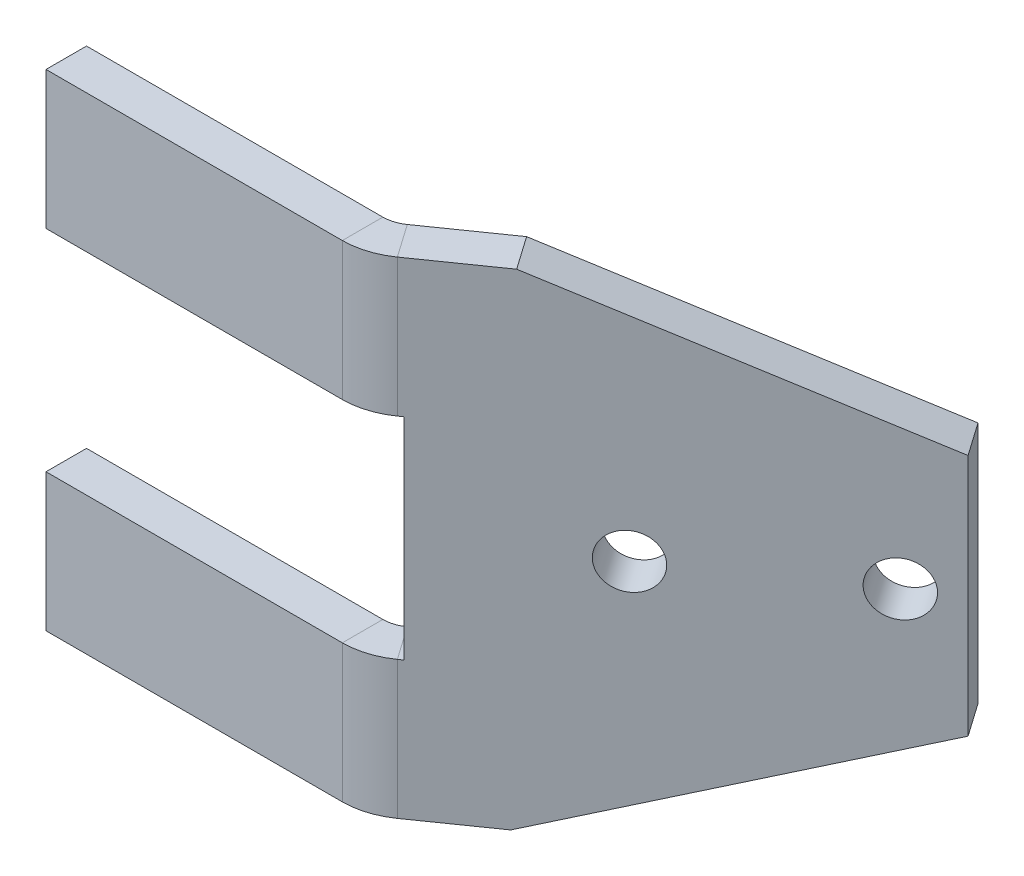
ISO-10303-21;
HEADER;
FILE_DESCRIPTION(('STEP AP214'),'2;1');
FILE_NAME('part.step','',(''),(''),'','','');
FILE_SCHEMA(('AUTOMOTIVE_DESIGN { 1 0 10303 214 1 1 1 1 }'));
ENDSEC;
DATA;
#1=APPLICATION_CONTEXT('core data for automotive mechanical design processes');
#2=APPLICATION_PROTOCOL_DEFINITION('international standard','automotive_design',2000,#1);
#3=PRODUCT_CONTEXT('',#1,'mechanical');
#4=PRODUCT('Part','Part','',(#3));
#5=PRODUCT_RELATED_PRODUCT_CATEGORY('part','',(#4));
#6=PRODUCT_DEFINITION_FORMATION('','',#4);
#7=PRODUCT_DEFINITION_CONTEXT('part definition',#1,'design');
#8=PRODUCT_DEFINITION('design','',#6,#7);
#9=PRODUCT_DEFINITION_SHAPE('','',#8);
#10=(LENGTH_UNIT() NAMED_UNIT(*) SI_UNIT(.MILLI.,.METRE.));
#11=(NAMED_UNIT(*) PLANE_ANGLE_UNIT() SI_UNIT($,.RADIAN.));
#12=(NAMED_UNIT(*) SI_UNIT($,.STERADIAN.) SOLID_ANGLE_UNIT());
#13=UNCERTAINTY_MEASURE_WITH_UNIT(LENGTH_MEASURE(1.E-05),#10,'distance_accuracy_value','');
#14=(GEOMETRIC_REPRESENTATION_CONTEXT(3) GLOBAL_UNCERTAINTY_ASSIGNED_CONTEXT((#13)) GLOBAL_UNIT_ASSIGNED_CONTEXT((#10,
#11,#12)) REPRESENTATION_CONTEXT('',''));
#15=CARTESIAN_POINT('',(0.,0.,0.));
#16=DIRECTION('',(0.,0.,1.));
#17=DIRECTION('',(1.,0.,0.));
#18=AXIS2_PLACEMENT_3D('',#15,#16,#17);
#19=CARTESIAN_POINT('',(54.7746723395931,44.4613849765258,-2.5));
#20=DIRECTION('',(0.,-1.,0.));
#21=DIRECTION('',(0.,0.,-1.));
#22=AXIS2_PLACEMENT_3D('',#19,#20,#21);
#23=PLANE('',#22);
#24=DIRECTION('',(1.,0.,0.));
#25=VECTOR('',#24,1.);
#26=CARTESIAN_POINT('',(54.7746723395931,44.4613849765258,-2.5));
#27=LINE('',#26,#25);
#28=CARTESIAN_POINT('',(54.7746723395931,44.4613849765258,-2.5));
#29=VERTEX_POINT('',#28);
#30=CARTESIAN_POINT('',(73.0608277896377,44.4613849765258,-2.5));
#31=VERTEX_POINT('',#30);
#32=EDGE_CURVE('E312',#29,#31,#27,.T.);
#33=ORIENTED_EDGE('',*,*,#32,.T.);
#34=DIRECTION('',(0.,0.,1.));
#35=VECTOR('',#34,1.);
#36=CARTESIAN_POINT('',(73.0608277896377,44.4613849765258,-2.5));
#37=LINE('',#36,#35);
#38=CARTESIAN_POINT('',(73.0608277896377,44.4613849765258,0.));
#39=VERTEX_POINT('',#38);
#40=EDGE_CURVE('E12',#31,#39,#37,.T.);
#41=ORIENTED_EDGE('',*,*,#40,.T.);
#42=DIRECTION('',(1.,0.,0.));
#43=VECTOR('',#42,1.);
#44=CARTESIAN_POINT('',(54.7746723395931,44.4613849765258,0.));
#45=LINE('',#44,#43);
#46=CARTESIAN_POINT('',(54.7746723395931,44.4613849765258,0.));
#47=VERTEX_POINT('',#46);
#48=EDGE_CURVE('E56',#47,#39,#45,.T.);
#49=ORIENTED_EDGE('',*,*,#48,.F.);
#50=DIRECTION('',(0.,0.,1.));
#51=VECTOR('',#50,1.);
#52=CARTESIAN_POINT('',(54.7746723395931,44.4613849765258,-2.5));
#53=LINE('',#52,#51);
#54=EDGE_CURVE('E315',#29,#47,#53,.T.);
#55=ORIENTED_EDGE('',*,*,#54,.F.);
#56=EDGE_LOOP('',(#33,#41,#49,#55));
#57=FACE_BOUND('',#56,.T.);
#58=ADVANCED_FACE('F40',(#57),#23,.T.);
#59=CARTESIAN_POINT('',(54.7746723395931,52.9613849765258,-2.5));
#60=DIRECTION('',(0.,1.,0.));
#61=DIRECTION('',(0.,0.,1.));
#62=AXIS2_PLACEMENT_3D('',#59,#60,#61);
#63=PLANE('',#62);
#64=DIRECTION('',(-1.,0.,0.));
#65=VECTOR('',#64,1.);
#66=CARTESIAN_POINT('',(54.7746723395931,52.9613849765258,0.));
#67=LINE('',#66,#65);
#68=CARTESIAN_POINT('',(73.0608277896377,52.9613849765258,0.));
#69=VERTEX_POINT('',#68);
#70=CARTESIAN_POINT('',(54.7746723395931,52.9613849765258,0.));
#71=VERTEX_POINT('',#70);
#72=EDGE_CURVE('E63',#69,#71,#67,.T.);
#73=ORIENTED_EDGE('',*,*,#72,.F.);
#74=DIRECTION('',(0.,0.,-1.));
#75=VECTOR('',#74,1.);
#76=CARTESIAN_POINT('',(73.0608277896377,52.9613849765258,-2.5));
#77=LINE('',#76,#75);
#78=CARTESIAN_POINT('',(73.0608277896377,52.9613849765258,-2.5));
#79=VERTEX_POINT('',#78);
#80=EDGE_CURVE('E322',#69,#79,#77,.T.);
#81=ORIENTED_EDGE('',*,*,#80,.T.);
#82=DIRECTION('',(-1.,0.,0.));
#83=VECTOR('',#82,1.);
#84=CARTESIAN_POINT('',(54.7746723395931,52.9613849765258,-2.5));
#85=LINE('',#84,#83);
#86=CARTESIAN_POINT('',(54.7746723395931,52.9613849765258,-2.5));
#87=VERTEX_POINT('',#86);
#88=EDGE_CURVE('E43',#79,#87,#85,.T.);
#89=ORIENTED_EDGE('',*,*,#88,.T.);
#90=DIRECTION('',(0.,0.,1.));
#91=VECTOR('',#90,1.);
#92=CARTESIAN_POINT('',(54.7746723395931,52.9613849765258,-2.5));
#93=LINE('',#92,#91);
#94=EDGE_CURVE('E318',#87,#71,#93,.T.);
#95=ORIENTED_EDGE('',*,*,#94,.T.);
#96=EDGE_LOOP('',(#73,#81,#89,#95));
#97=FACE_BOUND('',#96,.T.);
#98=ADVANCED_FACE('F332',(#97),#63,.T.);
#99=CARTESIAN_POINT('',(54.7746723395931,31.4613849765258,0.));
#100=DIRECTION('',(0.,0.,1.));
#101=DIRECTION('',(1.,0.,0.));
#102=AXIS2_PLACEMENT_3D('',#99,#100,#101);
#103=PLANE('',#102);
#104=ORIENTED_EDGE('',*,*,#48,.T.);
#105=DIRECTION('',(0.,1.,0.));
#106=VECTOR('',#105,1.);
#107=CARTESIAN_POINT('',(73.0608277896377,31.4613849765258,0.));
#108=LINE('',#107,#106);
#109=EDGE_CURVE('E48',#39,#69,#108,.T.);
#110=ORIENTED_EDGE('',*,*,#109,.T.);
#111=ORIENTED_EDGE('',*,*,#72,.T.);
#112=DIRECTION('',(0.,-1.,0.));
#113=VECTOR('',#112,1.);
#114=CARTESIAN_POINT('',(54.7746723395931,44.4613849765258,0.));
#115=LINE('',#114,#113);
#116=EDGE_CURVE('E313',#71,#47,#115,.T.);
#117=ORIENTED_EDGE('',*,*,#116,.T.);
#118=EDGE_LOOP('',(#104,#110,#111,#117));
#119=FACE_BOUND('',#118,.T.);
#120=ADVANCED_FACE('F327',(#119),#103,.T.);
#121=CARTESIAN_POINT('',(54.7746723395931,44.4613849765258,-2.5));
#122=DIRECTION('',(-1.,0.,0.));
#123=DIRECTION('',(0.,0.,1.));
#124=AXIS2_PLACEMENT_3D('',#121,#122,#123);
#125=PLANE('',#124);
#126=ORIENTED_EDGE('',*,*,#116,.F.);
#127=ORIENTED_EDGE('',*,*,#94,.F.);
#128=DIRECTION('',(0.,-1.,0.));
#129=VECTOR('',#128,1.);
#130=CARTESIAN_POINT('',(54.7746723395931,44.4613849765258,-2.5));
#131=LINE('',#130,#129);
#132=EDGE_CURVE('E309',#87,#29,#131,.T.);
#133=ORIENTED_EDGE('',*,*,#132,.T.);
#134=ORIENTED_EDGE('',*,*,#54,.T.);
#135=EDGE_LOOP('',(#126,#127,#133,#134));
#136=FACE_BOUND('',#135,.T.);
#137=ADVANCED_FACE('F336',(#136),#125,.T.);
#138=CARTESIAN_POINT('',(54.7746723395931,31.4613849765258,-2.5));
#139=DIRECTION('',(0.,0.,1.));
#140=DIRECTION('',(1.,0.,0.));
#141=AXIS2_PLACEMENT_3D('',#138,#139,#140);
#142=PLANE('',#141);
#143=DIRECTION('',(0.,1.,0.));
#144=VECTOR('',#143,1.);
#145=CARTESIAN_POINT('',(73.0608277896377,31.4613849765258,-2.5));
#146=LINE('',#145,#144);
#147=EDGE_CURVE('E317',#31,#79,#146,.T.);
#148=ORIENTED_EDGE('',*,*,#147,.F.);
#149=ORIENTED_EDGE('',*,*,#32,.F.);
#150=ORIENTED_EDGE('',*,*,#132,.F.);
#151=ORIENTED_EDGE('',*,*,#88,.F.);
#152=EDGE_LOOP('',(#148,#149,#150,#151));
#153=FACE_BOUND('',#152,.T.);
#154=ADVANCED_FACE('F368',(#153),#142,.F.);
#155=CARTESIAN_POINT('',(94.921186591453,30.4613849765258,-17.3652388434772));
#156=DIRECTION('',(0.284341886021681,-0.937821702691951,-0.199098332021148));
#157=DIRECTION('',(0.768218564938694,0.347117348975775,-0.537912430162721));
#158=AXIS2_PLACEMENT_3D('',#155,#156,#157);
#159=PLANE('',#158);
#160=DIRECTION('',(0.768218564938694,0.347117348975775,-0.537912430162721));
#161=VECTOR('',#160,1.);
#162=CARTESIAN_POINT('',(96.3551276823306,30.4613849765258,-15.3173587327547));
#163=LINE('',#162,#161);
#164=CARTESIAN_POINT('',(79.7565933421692,22.9613849765258,-3.69493986454089));
#165=VERTEX_POINT('',#164);
#166=CARTESIAN_POINT('',(96.3551276823306,30.4613849765258,-15.3173587327547));
#167=VERTEX_POINT('',#166);
#168=EDGE_CURVE('E247',#165,#167,#163,.T.);
#169=ORIENTED_EDGE('',*,*,#168,.F.);
#170=DIRECTION('',(0.573576436351047,0.,0.819152044288991));
#171=VECTOR('',#170,1.);
#172=CARTESIAN_POINT('',(78.3226522512915,22.9613849765258,-5.74281997526337));
#173=LINE('',#172,#171);
#174=CARTESIAN_POINT('',(78.3226522512915,22.9613849765258,-5.74281997526337));
#175=VERTEX_POINT('',#174);
#176=EDGE_CURVE('E220',#175,#165,#173,.T.);
#177=ORIENTED_EDGE('',*,*,#176,.F.);
#178=DIRECTION('',(0.768218564938694,0.347117348975775,-0.537912430162721));
#179=VECTOR('',#178,1.);
#180=CARTESIAN_POINT('',(94.921186591453,30.4613849765258,-17.3652388434772));
#181=LINE('',#180,#179);
#182=CARTESIAN_POINT('',(94.921186591453,30.4613849765258,-17.3652388434772));
#183=VERTEX_POINT('',#182);
#184=EDGE_CURVE('E289',#175,#183,#181,.T.);
#185=ORIENTED_EDGE('',*,*,#184,.T.);
#186=DIRECTION('',(0.573576436351047,0.,0.819152044288991));
#187=VECTOR('',#186,1.);
#188=CARTESIAN_POINT('',(94.921186591453,30.4613849765258,-17.3652388434772));
#189=LINE('',#188,#187);
#190=EDGE_CURVE('E287',#183,#167,#189,.T.);
#191=ORIENTED_EDGE('',*,*,#190,.T.);
#192=EDGE_LOOP('',(#169,#177,#185,#191));
#193=FACE_BOUND('',#192,.T.);
#194=ADVANCED_FACE('F402',(#193),#159,.T.);
#195=CARTESIAN_POINT('',(94.921186591453,30.4613849765258,-17.3652388434772));
#196=DIRECTION('',(0.819152044288991,0.,-0.573576436351047));
#197=DIRECTION('',(-0.573576436351047,0.,-0.819152044288991));
#198=AXIS2_PLACEMENT_3D('',#195,#196,#197);
#199=PLANE('',#198);
#200=DIRECTION('',(0.,1.,0.));
#201=VECTOR('',#200,1.);
#202=CARTESIAN_POINT('',(96.3551276823306,30.4613849765258,-15.3173587327547));
#203=LINE('',#202,#201);
#204=CARTESIAN_POINT('',(96.3551276823306,45.4613849765258,-15.3173587327547));
#205=VERTEX_POINT('',#204);
#206=EDGE_CURVE('E244',#167,#205,#203,.T.);
#207=ORIENTED_EDGE('',*,*,#206,.F.);
#208=ORIENTED_EDGE('',*,*,#190,.F.);
#209=DIRECTION('',(0.,1.,0.));
#210=VECTOR('',#209,1.);
#211=CARTESIAN_POINT('',(94.921186591453,30.4613849765258,-17.3652388434772));
#212=LINE('',#211,#210);
#213=CARTESIAN_POINT('',(94.921186591453,45.4613849765258,-17.3652388434772));
#214=VERTEX_POINT('',#213);
#215=EDGE_CURVE('E284',#183,#214,#212,.T.);
#216=ORIENTED_EDGE('',*,*,#215,.T.);
#217=DIRECTION('',(0.573576436351047,0.,0.819152044288991));
#218=VECTOR('',#217,1.);
#219=CARTESIAN_POINT('',(94.921186591453,45.4613849765258,-17.3652388434772));
#220=LINE('',#219,#218);
#221=EDGE_CURVE('E282',#214,#205,#220,.T.);
#222=ORIENTED_EDGE('',*,*,#221,.T.);
#223=EDGE_LOOP('',(#207,#208,#216,#222));
#224=FACE_BOUND('',#223,.T.);
#225=ADVANCED_FACE('F405',(#224),#199,.T.);
#226=CARTESIAN_POINT('',(78.5381457056732,52.9613849765258,-5.89371011645624));
#227=DIRECTION('',(0.287623484974917,0.936329177569045,-0.201396132345585));
#228=DIRECTION('',(-0.766995959933113,0.351123441588392,0.53705635292156));
#229=AXIS2_PLACEMENT_3D('',#226,#227,#228);
#230=PLANE('',#229);
#231=DIRECTION('',(-0.766995959933113,0.351123441588392,0.53705635292156));
#232=VECTOR('',#231,1.);
#233=CARTESIAN_POINT('',(79.9720867965508,52.9613849765258,-3.84583000573377));
#234=LINE('',#233,#232);
#235=CARTESIAN_POINT('',(79.9720867965508,52.9613849765258,-3.84583000573377));
#236=VERTEX_POINT('',#235);
#237=EDGE_CURVE('E241',#205,#236,#234,.T.);
#238=ORIENTED_EDGE('',*,*,#237,.F.);
#239=ORIENTED_EDGE('',*,*,#221,.F.);
#240=DIRECTION('',(-0.766995959933113,0.351123441588392,0.53705635292156));
#241=VECTOR('',#240,1.);
#242=CARTESIAN_POINT('',(78.5381457056732,52.9613849765258,-5.89371011645624));
#243=LINE('',#242,#241);
#244=CARTESIAN_POINT('',(78.5381457056732,52.9613849765258,-5.89371011645624));
#245=VERTEX_POINT('',#244);
#246=EDGE_CURVE('E279',#214,#245,#243,.T.);
#247=ORIENTED_EDGE('',*,*,#246,.T.);
#248=DIRECTION('',(0.573576436351047,0.,0.819152044288991));
#249=VECTOR('',#248,1.);
#250=CARTESIAN_POINT('',(78.5381457056732,52.9613849765258,-5.89371011645624));
#251=LINE('',#250,#249);
#252=EDGE_CURVE('E277',#245,#236,#251,.T.);
#253=ORIENTED_EDGE('',*,*,#252,.T.);
#254=EDGE_LOOP('',(#238,#239,#247,#253));
#255=FACE_BOUND('',#254,.T.);
#256=ADVANCED_FACE('F408',(#255),#230,.T.);
#257=CARTESIAN_POINT('',(74.4423854842282,44.4613849765258,-3.02582793470101));
#258=DIRECTION('',(-0.819152044288991,0.,0.573576436351047));
#259=DIRECTION('',(0.573576436351047,0.,0.819152044288991));
#260=AXIS2_PLACEMENT_3D('',#257,#258,#259);
#261=PLANE('',#260);
#262=DIRECTION('',(0.,-1.,0.));
#263=VECTOR('',#262,1.);
#264=CARTESIAN_POINT('',(75.8763265751058,44.4613849765258,-0.977947823978538));
#265=LINE('',#264,#263);
#266=CARTESIAN_POINT('',(75.8763265751058,44.4613849765258,-0.977947823978538));
#267=VERTEX_POINT('',#266);
#268=CARTESIAN_POINT('',(75.8763265751058,31.4613849765258,-0.977947823978538));
#269=VERTEX_POINT('',#268);
#270=EDGE_CURVE('E234',#267,#269,#265,.T.);
#271=ORIENTED_EDGE('',*,*,#270,.F.);
#272=DIRECTION('',(0.573576436351047,0.,0.819152044288991));
#273=VECTOR('',#272,1.);
#274=CARTESIAN_POINT('',(74.4423854842282,44.4613849765258,-3.02582793470101));
#275=LINE('',#274,#273);
#276=CARTESIAN_POINT('',(74.4423854842282,44.4613849765258,-3.02582793470101));
#277=VERTEX_POINT('',#276);
#278=EDGE_CURVE('E227',#277,#267,#275,.T.);
#279=ORIENTED_EDGE('',*,*,#278,.F.);
#280=DIRECTION('',(0.,-1.,0.));
#281=VECTOR('',#280,1.);
#282=CARTESIAN_POINT('',(74.4423854842282,44.4613849765258,-3.02582793470101));
#283=LINE('',#282,#281);
#284=CARTESIAN_POINT('',(74.4423854842282,31.4613849765258,-3.02582793470101));
#285=VERTEX_POINT('',#284);
#286=EDGE_CURVE('E274',#277,#285,#283,.T.);
#287=ORIENTED_EDGE('',*,*,#286,.T.);
#288=DIRECTION('',(0.573576436351047,0.,0.819152044288991));
#289=VECTOR('',#288,1.);
#290=CARTESIAN_POINT('',(74.4423854842282,31.4613849765258,-3.02582793470101));
#291=LINE('',#290,#289);
#292=EDGE_CURVE('E272',#285,#269,#291,.T.);
#293=ORIENTED_EDGE('',*,*,#292,.T.);
#294=EDGE_LOOP('',(#271,#279,#287,#293));
#295=FACE_BOUND('',#294,.T.);
#296=ADVANCED_FACE('F377',(#295),#261,.T.);
#297=CARTESIAN_POINT('',(93.8976715494636,37.9613849765258,-13.5966294237016));
#298=DIRECTION('',(0.573576436351047,0.,0.819152044288991));
#299=DIRECTION('',(0.819152044288991,0.,-0.573576436351047));
#300=AXIS2_PLACEMENT_3D('',#297,#298,#299);
#301=CYLINDRICAL_SURFACE('',#300,1.64999999999999);
#302=CARTESIAN_POINT('',(92.463730458586,37.9613849765258,-15.644509534424));
#303=DIRECTION('',(0.573576436351047,0.,0.819152044288991));
#304=DIRECTION('',(0.819152044288991,0.,-0.573576436351047));
#305=AXIS2_PLACEMENT_3D('',#302,#303,#304);
#306=CIRCLE('',#305,1.65);
#307=CARTESIAN_POINT('',(93.8153313316628,37.9613849765258,-16.5909106544033));
#308=VERTEX_POINT('',#307);
#309=EDGE_CURVE('E260',#308,#308,#306,.T.);
#310=ORIENTED_EDGE('',*,*,#309,.F.);
#311=EDGE_LOOP('',(#310));
#312=FACE_BOUND('',#311,.T.);
#313=CARTESIAN_POINT('',(93.8976715494636,37.9613849765258,-13.5966294237016));
#314=DIRECTION('',(0.573576436351047,0.,0.819152044288991));
#315=DIRECTION('',(0.819152044288991,0.,-0.573576436351047));
#316=AXIS2_PLACEMENT_3D('',#313,#314,#315);
#317=CIRCLE('',#316,1.64999999999998);
#318=CARTESIAN_POINT('',(95.2492724225405,37.9613849765258,-14.5430305436808));
#319=VERTEX_POINT('',#318);
#320=EDGE_CURVE('E269',#319,#319,#317,.T.);
#321=ORIENTED_EDGE('',*,*,#320,.T.);
#322=EDGE_LOOP('',(#321));
#323=FACE_BOUND('',#322,.T.);
#324=ADVANCED_FACE('F465',(#312,#323),#301,.F.);
#325=CARTESIAN_POINT('',(84.0678470179958,37.9613849765258,-6.71371218748901));
#326=DIRECTION('',(0.573576436351047,0.,0.819152044288991));
#327=DIRECTION('',(0.819152044288991,0.,-0.573576436351047));
#328=AXIS2_PLACEMENT_3D('',#325,#326,#327);
#329=CYLINDRICAL_SURFACE('',#328,1.64999999999999);
#330=CARTESIAN_POINT('',(82.6339059271181,37.9613849765258,-8.76159229821148));
#331=DIRECTION('',(0.573576436351047,0.,0.819152044288991));
#332=DIRECTION('',(0.819152044288991,0.,-0.573576436351047));
#333=AXIS2_PLACEMENT_3D('',#330,#331,#332);
#334=CIRCLE('',#333,1.65);
#335=CARTESIAN_POINT('',(83.985506800195,37.9613849765258,-9.70799341819071));
#336=VERTEX_POINT('',#335);
#337=EDGE_CURVE('E263',#336,#336,#334,.T.);
#338=ORIENTED_EDGE('',*,*,#337,.F.);
#339=EDGE_LOOP('',(#338));
#340=FACE_BOUND('',#339,.T.);
#341=CARTESIAN_POINT('',(84.0678470179958,37.9613849765258,-6.71371218748901));
#342=DIRECTION('',(0.573576436351047,0.,0.819152044288991));
#343=DIRECTION('',(0.819152044288991,0.,-0.573576436351047));
#344=AXIS2_PLACEMENT_3D('',#341,#342,#343);
#345=CIRCLE('',#344,1.64999999999998);
#346=CARTESIAN_POINT('',(85.4194478910726,37.9613849765258,-7.66011330746823));
#347=VERTEX_POINT('',#346);
#348=EDGE_CURVE('E266',#347,#347,#345,.T.);
#349=ORIENTED_EDGE('',*,*,#348,.T.);
#350=EDGE_LOOP('',(#349));
#351=FACE_BOUND('',#350,.T.);
#352=ADVANCED_FACE('F461',(#340,#351),#329,.F.);
#353=CARTESIAN_POINT('',(58.8784966427374,31.4613849765258,7.87212435596889));
#354=DIRECTION('',(0.573576436351047,0.,0.819152044288991));
#355=DIRECTION('',(0.819152044288991,0.,-0.573576436351047));
#356=AXIS2_PLACEMENT_3D('',#353,#354,#355);
#357=PLANE('',#356);
#358=ORIENTED_EDGE('',*,*,#337,.T.);
#359=EDGE_LOOP('',(#358));
#360=FACE_BOUND('',#359,.T.);
#361=ORIENTED_EDGE('',*,*,#309,.T.);
#362=EDGE_LOOP('',(#361));
#363=FACE_BOUND('',#362,.T.);
#364=DIRECTION('',(0.819152044288991,0.,-0.573576436351047));
#365=VECTOR('',#364,1.);
#366=CARTESIAN_POINT('',(58.8784966427374,22.9613849765258,7.87212435596889));
#367=LINE('',#366,#365);
#368=CARTESIAN_POINT('',(74.2079806623398,22.9613849765258,-2.86169591142202));
#369=VERTEX_POINT('',#368);
#370=EDGE_CURVE('E223',#369,#175,#367,.T.);
#371=ORIENTED_EDGE('',*,*,#370,.F.);
#372=DIRECTION('',(0.,1.,0.));
#373=VECTOR('',#372,1.);
#374=CARTESIAN_POINT('',(74.2079806623398,31.4613849765258,-2.86169591142202));
#375=LINE('',#374,#373);
#376=CARTESIAN_POINT('',(74.2079806623398,31.4613849765258,-2.86169591142203));
#377=VERTEX_POINT('',#376);
#378=EDGE_CURVE('E257',#369,#377,#375,.T.);
#379=ORIENTED_EDGE('',*,*,#378,.T.);
#380=DIRECTION('',(-0.819152044288991,0.,0.573576436351047));
#381=VECTOR('',#380,1.);
#382=CARTESIAN_POINT('',(74.4423854842282,31.4613849765258,-3.02582793470101));
#383=LINE('',#382,#381);
#384=EDGE_CURVE('E225',#285,#377,#383,.T.);
#385=ORIENTED_EDGE('',*,*,#384,.F.);
#386=ORIENTED_EDGE('',*,*,#286,.F.);
#387=DIRECTION('',(0.819152044288991,0.,-0.573576436351047));
#388=VECTOR('',#387,1.);
#389=CARTESIAN_POINT('',(58.8784966427374,44.4613849765258,7.87212435596889));
#390=LINE('',#389,#388);
#391=CARTESIAN_POINT('',(74.2079806623398,44.4613849765258,-2.86169591142202));
#392=VERTEX_POINT('',#391);
#393=EDGE_CURVE('E230',#392,#277,#390,.T.);
#394=ORIENTED_EDGE('',*,*,#393,.F.);
#395=DIRECTION('',(0.,1.,0.));
#396=VECTOR('',#395,1.);
#397=CARTESIAN_POINT('',(74.2079806623398,31.4613849765258,-2.86169591142202));
#398=LINE('',#397,#396);
#399=CARTESIAN_POINT('',(74.2079806623398,52.9613849765258,-2.86169591142203));
#400=VERTEX_POINT('',#399);
#401=EDGE_CURVE('E254',#392,#400,#398,.T.);
#402=ORIENTED_EDGE('',*,*,#401,.T.);
#403=DIRECTION('',(-0.819152044288991,0.,0.573576436351047));
#404=VECTOR('',#403,1.);
#405=CARTESIAN_POINT('',(58.8784966427374,52.9613849765258,7.87212435596889));
#406=LINE('',#405,#404);
#407=EDGE_CURVE('E252',#245,#400,#406,.T.);
#408=ORIENTED_EDGE('',*,*,#407,.F.);
#409=ORIENTED_EDGE('',*,*,#246,.F.);
#410=ORIENTED_EDGE('',*,*,#215,.F.);
#411=ORIENTED_EDGE('',*,*,#184,.F.);
#412=EDGE_LOOP('',(#371,#379,#385,#386,#394,#402,#408,#409,#410,#411));
#413=FACE_BOUND('',#412,.T.);
#414=ADVANCED_FACE('F372',(#360,#363,#413),#357,.F.);
#415=CARTESIAN_POINT('',(58.8784966427374,52.9613849765258,7.87212435596889));
#416=DIRECTION('',(0.,1.,0.));
#417=DIRECTION('',(0.573576436351047,0.,0.819152044288991));
#418=AXIS2_PLACEMENT_3D('',#415,#416,#417);
#419=PLANE('',#418);
#420=DIRECTION('',(-0.573576436351047,0.,-0.819152044288991));
#421=VECTOR('',#420,1.);
#422=CARTESIAN_POINT('',(74.2079806623398,52.9613849765258,-2.86169591142202));
#423=LINE('',#422,#421);
#424=CARTESIAN_POINT('',(75.6419217532174,52.9613849765258,-0.813815800699544));
#425=VERTEX_POINT('',#424);
#426=EDGE_CURVE('E292',#425,#400,#423,.T.);
#427=ORIENTED_EDGE('',*,*,#426,.F.);
#428=DIRECTION('',(-0.819152044288991,0.,0.573576436351047));
#429=VECTOR('',#428,1.);
#430=CARTESIAN_POINT('',(60.312437733615,52.9613849765258,9.92000446669136));
#431=LINE('',#430,#429);
#432=EDGE_CURVE('E239',#236,#425,#431,.T.);
#433=ORIENTED_EDGE('',*,*,#432,.F.);
#434=ORIENTED_EDGE('',*,*,#252,.F.);
#435=ORIENTED_EDGE('',*,*,#407,.T.);
#436=EDGE_LOOP('',(#427,#433,#434,#435));
#437=FACE_BOUND('',#436,.T.);
#438=ADVANCED_FACE('F362',(#437),#419,.T.);
#439=CARTESIAN_POINT('',(60.312437733615,31.4613849765258,9.92000446669136));
#440=DIRECTION('',(0.573576436351047,0.,0.819152044288991));
#441=DIRECTION('',(0.819152044288991,0.,-0.573576436351047));
#442=AXIS2_PLACEMENT_3D('',#439,#440,#441);
#443=PLANE('',#442);
#444=DIRECTION('',(0.,1.,0.));
#445=VECTOR('',#444,1.);
#446=CARTESIAN_POINT('',(75.6419217532174,31.4613849765258,-0.813815800699544));
#447=LINE('',#446,#445);
#448=CARTESIAN_POINT('',(75.6419217532174,22.9613849765258,-0.813815800699544));
#449=VERTEX_POINT('',#448);
#450=CARTESIAN_POINT('',(75.6419217532174,31.4613849765258,-0.813815800699544));
#451=VERTEX_POINT('',#450);
#452=EDGE_CURVE('E304',#449,#451,#447,.T.);
#453=ORIENTED_EDGE('',*,*,#452,.F.);
#454=DIRECTION('',(0.819152044288991,0.,-0.573576436351047));
#455=VECTOR('',#454,1.);
#456=CARTESIAN_POINT('',(60.312437733615,22.9613849765258,9.92000446669136));
#457=LINE('',#456,#455);
#458=EDGE_CURVE('E250',#449,#165,#457,.T.);
#459=ORIENTED_EDGE('',*,*,#458,.T.);
#460=ORIENTED_EDGE('',*,*,#168,.T.);
#461=ORIENTED_EDGE('',*,*,#206,.T.);
#462=ORIENTED_EDGE('',*,*,#237,.T.);
#463=ORIENTED_EDGE('',*,*,#432,.T.);
#464=DIRECTION('',(0.,1.,0.));
#465=VECTOR('',#464,1.);
#466=CARTESIAN_POINT('',(75.6419217532174,31.4613849765258,-0.813815800699544));
#467=LINE('',#466,#465);
#468=CARTESIAN_POINT('',(75.6419217532174,44.4613849765258,-0.813815800699544));
#469=VERTEX_POINT('',#468);
#470=EDGE_CURVE('E295',#469,#425,#467,.T.);
#471=ORIENTED_EDGE('',*,*,#470,.F.);
#472=DIRECTION('',(0.819152044288991,0.,-0.573576436351047));
#473=VECTOR('',#472,1.);
#474=CARTESIAN_POINT('',(60.312437733615,44.4613849765258,9.92000446669136));
#475=LINE('',#474,#473);
#476=EDGE_CURVE('E237',#469,#267,#475,.T.);
#477=ORIENTED_EDGE('',*,*,#476,.T.);
#478=ORIENTED_EDGE('',*,*,#270,.T.);
#479=DIRECTION('',(-0.819152044288991,0.,0.573576436351047));
#480=VECTOR('',#479,1.);
#481=CARTESIAN_POINT('',(75.8763265751058,31.4613849765258,-0.977947823978538));
#482=LINE('',#481,#480);
#483=EDGE_CURVE('E232',#269,#451,#482,.T.);
#484=ORIENTED_EDGE('',*,*,#483,.T.);
#485=EDGE_LOOP('',(#453,#459,#460,#461,#462,#463,#471,#477,#478,#484));
#486=FACE_BOUND('',#485,.T.);
#487=ORIENTED_EDGE('',*,*,#348,.F.);
#488=EDGE_LOOP('',(#487));
#489=FACE_BOUND('',#488,.T.);
#490=ORIENTED_EDGE('',*,*,#320,.F.);
#491=EDGE_LOOP('',(#490));
#492=FACE_BOUND('',#491,.T.);
#493=ADVANCED_FACE('F356',(#486,#489,#492),#443,.T.);
#494=CARTESIAN_POINT('',(58.8784966427374,44.4613849765258,7.87212435596889));
#495=DIRECTION('',(0.,-1.,0.));
#496=DIRECTION('',(-0.573576436351047,0.,-0.819152044288991));
#497=AXIS2_PLACEMENT_3D('',#494,#495,#496);
#498=PLANE('',#497);
#499=DIRECTION('',(0.573576436351047,0.,0.819152044288991));
#500=VECTOR('',#499,1.);
#501=CARTESIAN_POINT('',(74.2079806623398,44.4613849765258,-2.86169591142202));
#502=LINE('',#501,#500);
#503=EDGE_CURVE('E298',#392,#469,#502,.T.);
#504=ORIENTED_EDGE('',*,*,#503,.F.);
#505=ORIENTED_EDGE('',*,*,#393,.T.);
#506=ORIENTED_EDGE('',*,*,#278,.T.);
#507=ORIENTED_EDGE('',*,*,#476,.F.);
#508=EDGE_LOOP('',(#504,#505,#506,#507));
#509=FACE_BOUND('',#508,.T.);
#510=ADVANCED_FACE('F350',(#509),#498,.T.);
#511=CARTESIAN_POINT('',(74.4423854842282,31.4613849765258,-3.02582793470101));
#512=DIRECTION('',(0.,1.,0.));
#513=DIRECTION('',(0.573576436351047,0.,0.819152044288991));
#514=AXIS2_PLACEMENT_3D('',#511,#512,#513);
#515=PLANE('',#514);
#516=DIRECTION('',(-0.573576436351047,0.,-0.819152044288991));
#517=VECTOR('',#516,1.);
#518=CARTESIAN_POINT('',(74.2079806623398,31.4613849765258,-2.86169591142202));
#519=LINE('',#518,#517);
#520=EDGE_CURVE('E301',#451,#377,#519,.T.);
#521=ORIENTED_EDGE('',*,*,#520,.F.);
#522=ORIENTED_EDGE('',*,*,#483,.F.);
#523=ORIENTED_EDGE('',*,*,#292,.F.);
#524=ORIENTED_EDGE('',*,*,#384,.T.);
#525=EDGE_LOOP('',(#521,#522,#523,#524));
#526=FACE_BOUND('',#525,.T.);
#527=ADVANCED_FACE('F381',(#526),#515,.T.);
#528=CARTESIAN_POINT('',(58.8784966427374,22.9613849765258,7.87212435596889));
#529=DIRECTION('',(0.,-1.,0.));
#530=DIRECTION('',(-0.573576436351047,0.,-0.819152044288991));
#531=AXIS2_PLACEMENT_3D('',#528,#529,#530);
#532=PLANE('',#531);
#533=DIRECTION('',(0.573576436351047,0.,0.819152044288991));
#534=VECTOR('',#533,1.);
#535=CARTESIAN_POINT('',(74.2079806623398,22.9613849765258,-2.86169591142202));
#536=LINE('',#535,#534);
#537=EDGE_CURVE('E215',#369,#449,#536,.T.);
#538=ORIENTED_EDGE('',*,*,#537,.F.);
#539=ORIENTED_EDGE('',*,*,#370,.T.);
#540=ORIENTED_EDGE('',*,*,#176,.T.);
#541=ORIENTED_EDGE('',*,*,#458,.F.);
#542=EDGE_LOOP('',(#538,#539,#540,#541));
#543=FACE_BOUND('',#542,.T.);
#544=ADVANCED_FACE('F397',(#543),#532,.T.);
#545=CARTESIAN_POINT('',(73.0608277896377,22.9613849765258,-4.5));
#546=DIRECTION('',(0.,1.,0.));
#547=DIRECTION('',(0.,0.,1.));
#548=AXIS2_PLACEMENT_3D('',#545,#546,#547);
#549=PLANE('',#548);
#550=ORIENTED_EDGE('',*,*,#537,.T.);
#551=CARTESIAN_POINT('',(73.0608277896377,22.9613849765258,-4.5));
#552=DIRECTION('',(0.,-1.,0.));
#553=DIRECTION('',(0.,0.,-1.));
#554=AXIS2_PLACEMENT_3D('',#551,#552,#553);
#555=CIRCLE('',#554,4.5);
#556=CARTESIAN_POINT('',(73.0608277896377,22.9613849765258,0.));
#557=VERTEX_POINT('',#556);
#558=EDGE_CURVE('E203',#449,#557,#555,.T.);
#559=ORIENTED_EDGE('',*,*,#558,.T.);
#560=DIRECTION('',(0.,0.,1.));
#561=VECTOR('',#560,1.);
#562=CARTESIAN_POINT('',(73.0608277896377,22.9613849765258,-2.5));
#563=LINE('',#562,#561);
#564=CARTESIAN_POINT('',(73.0608277896377,22.9613849765258,-2.5));
#565=VERTEX_POINT('',#564);
#566=EDGE_CURVE('E415',#565,#557,#563,.T.);
#567=ORIENTED_EDGE('',*,*,#566,.F.);
#568=CARTESIAN_POINT('',(73.0608277896377,22.9613849765258,-4.5));
#569=DIRECTION('',(0.,-1.,0.));
#570=DIRECTION('',(0.,0.,1.));
#571=AXIS2_PLACEMENT_3D('',#568,#569,#570);
#572=CIRCLE('',#571,2.);
#573=EDGE_CURVE('E208',#369,#565,#572,.T.);
#574=ORIENTED_EDGE('',*,*,#573,.F.);
#575=EDGE_LOOP('',(#550,#559,#567,#574));
#576=FACE_BOUND('',#575,.T.);
#577=ADVANCED_FACE('F393',(#576),#549,.F.);
#578=CARTESIAN_POINT('',(73.0608277896377,31.4613849765258,-4.5));
#579=DIRECTION('',(0.,-1.,0.));
#580=DIRECTION('',(0.,0.,-1.));
#581=AXIS2_PLACEMENT_3D('',#578,#579,#580);
#582=PLANE('',#581);
#583=DIRECTION('',(0.,0.,-1.));
#584=VECTOR('',#583,1.);
#585=CARTESIAN_POINT('',(73.0608277896377,31.4613849765258,-2.5));
#586=LINE('',#585,#584);
#587=CARTESIAN_POINT('',(73.0608277896377,31.4613849765258,0.));
#588=VERTEX_POINT('',#587);
#589=CARTESIAN_POINT('',(73.0608277896377,31.4613849765258,-2.5));
#590=VERTEX_POINT('',#589);
#591=EDGE_CURVE('E172',#588,#590,#586,.T.);
#592=ORIENTED_EDGE('',*,*,#591,.F.);
#593=CARTESIAN_POINT('',(73.0608277896377,31.4613849765258,-4.5));
#594=DIRECTION('',(0.,-1.,0.));
#595=DIRECTION('',(0.,0.,-1.));
#596=AXIS2_PLACEMENT_3D('',#593,#594,#595);
#597=CIRCLE('',#596,4.5);
#598=EDGE_CURVE('E212',#588,#451,#597,.F.);
#599=ORIENTED_EDGE('',*,*,#598,.T.);
#600=ORIENTED_EDGE('',*,*,#520,.T.);
#601=CARTESIAN_POINT('',(73.0608277896377,31.4613849765258,-4.5));
#602=DIRECTION('',(0.,1.,0.));
#603=DIRECTION('',(0.,0.,-1.));
#604=AXIS2_PLACEMENT_3D('',#601,#602,#603);
#605=CIRCLE('',#604,2.);
#606=EDGE_CURVE('E211',#590,#377,#605,.T.);
#607=ORIENTED_EDGE('',*,*,#606,.F.);
#608=EDGE_LOOP('',(#592,#599,#600,#607));
#609=FACE_BOUND('',#608,.T.);
#610=ADVANCED_FACE('F385',(#609),#582,.F.);
#611=CARTESIAN_POINT('',(73.0608277896377,36.0817242015038,-4.5));
#612=DIRECTION('',(0.,-1.,0.));
#613=DIRECTION('',(0.,0.,-1.));
#614=AXIS2_PLACEMENT_3D('',#611,#612,#613);
#615=CYLINDRICAL_SURFACE('',#614,2.);
#616=ORIENTED_EDGE('',*,*,#606,.T.);
#617=ORIENTED_EDGE('',*,*,#378,.F.);
#618=ORIENTED_EDGE('',*,*,#573,.T.);
#619=DIRECTION('',(0.,1.,0.));
#620=VECTOR('',#619,1.);
#621=CARTESIAN_POINT('',(73.0608277896377,31.4613849765258,-2.5));
#622=LINE('',#621,#620);
#623=EDGE_CURVE('E190',#565,#590,#622,.T.);
#624=ORIENTED_EDGE('',*,*,#623,.T.);
#625=EDGE_LOOP('',(#616,#617,#618,#624));
#626=FACE_BOUND('',#625,.T.);
#627=ADVANCED_FACE('F410',(#626),#615,.F.);
#628=CARTESIAN_POINT('',(73.0608277896377,36.0817242015038,-4.5));
#629=DIRECTION('',(0.,-1.,0.));
#630=DIRECTION('',(0.,0.,-1.));
#631=AXIS2_PLACEMENT_3D('',#628,#629,#630);
#632=CYLINDRICAL_SURFACE('',#631,4.5);
#633=ORIENTED_EDGE('',*,*,#598,.F.);
#634=DIRECTION('',(0.,1.,0.));
#635=VECTOR('',#634,1.);
#636=CARTESIAN_POINT('',(73.0608277896377,31.4613849765258,0.));
#637=LINE('',#636,#635);
#638=EDGE_CURVE('E418',#557,#588,#637,.T.);
#639=ORIENTED_EDGE('',*,*,#638,.F.);
#640=ORIENTED_EDGE('',*,*,#558,.F.);
#641=ORIENTED_EDGE('',*,*,#452,.T.);
#642=EDGE_LOOP('',(#633,#639,#640,#641));
#643=FACE_BOUND('',#642,.T.);
#644=ADVANCED_FACE('F389',(#643),#632,.T.);
#645=CARTESIAN_POINT('',(73.0608277896377,44.4613849765258,-4.5));
#646=DIRECTION('',(0.,1.,0.));
#647=DIRECTION('',(0.,0.,1.));
#648=AXIS2_PLACEMENT_3D('',#645,#646,#647);
#649=PLANE('',#648);
#650=ORIENTED_EDGE('',*,*,#503,.T.);
#651=CARTESIAN_POINT('',(73.0608277896377,44.4613849765258,-4.5));
#652=DIRECTION('',(0.,-1.,0.));
#653=DIRECTION('',(0.,0.,-1.));
#654=AXIS2_PLACEMENT_3D('',#651,#652,#653);
#655=CIRCLE('',#654,4.5);
#656=EDGE_CURVE('E183',#469,#39,#655,.T.);
#657=ORIENTED_EDGE('',*,*,#656,.T.);
#658=ORIENTED_EDGE('',*,*,#40,.F.);
#659=CARTESIAN_POINT('',(73.0608277896377,44.4613849765258,-4.5));
#660=DIRECTION('',(0.,-1.,0.));
#661=DIRECTION('',(0.,0.,1.));
#662=AXIS2_PLACEMENT_3D('',#659,#660,#661);
#663=CIRCLE('',#662,2.);
#664=EDGE_CURVE('E196',#392,#31,#663,.T.);
#665=ORIENTED_EDGE('',*,*,#664,.F.);
#666=EDGE_LOOP('',(#650,#657,#658,#665));
#667=FACE_BOUND('',#666,.T.);
#668=ADVANCED_FACE('F346',(#667),#649,.F.);
#669=CARTESIAN_POINT('',(73.0608277896377,52.9613849765258,-4.5));
#670=DIRECTION('',(0.,-1.,0.));
#671=DIRECTION('',(0.,0.,-1.));
#672=AXIS2_PLACEMENT_3D('',#669,#670,#671);
#673=PLANE('',#672);
#674=ORIENTED_EDGE('',*,*,#80,.F.);
#675=CARTESIAN_POINT('',(73.0608277896377,52.9613849765258,-4.5));
#676=DIRECTION('',(0.,-1.,0.));
#677=DIRECTION('',(0.,0.,-1.));
#678=AXIS2_PLACEMENT_3D('',#675,#676,#677);
#679=CIRCLE('',#678,4.5);
#680=EDGE_CURVE('E200',#69,#425,#679,.F.);
#681=ORIENTED_EDGE('',*,*,#680,.T.);
#682=ORIENTED_EDGE('',*,*,#426,.T.);
#683=CARTESIAN_POINT('',(73.0608277896377,52.9613849765258,-4.5));
#684=DIRECTION('',(0.,1.,0.));
#685=DIRECTION('',(0.,0.,-1.));
#686=AXIS2_PLACEMENT_3D('',#683,#684,#685);
#687=CIRCLE('',#686,2.);
#688=EDGE_CURVE('E199',#79,#400,#687,.T.);
#689=ORIENTED_EDGE('',*,*,#688,.F.);
#690=EDGE_LOOP('',(#674,#681,#682,#689));
#691=FACE_BOUND('',#690,.T.);
#692=ADVANCED_FACE('F366',(#691),#673,.F.);
#693=CARTESIAN_POINT('',(73.0608277896377,57.5817242015038,-4.5));
#694=DIRECTION('',(0.,-1.,0.));
#695=DIRECTION('',(0.,0.,-1.));
#696=AXIS2_PLACEMENT_3D('',#693,#694,#695);
#697=CYLINDRICAL_SURFACE('',#696,2.);
#698=ORIENTED_EDGE('',*,*,#688,.T.);
#699=ORIENTED_EDGE('',*,*,#401,.F.);
#700=ORIENTED_EDGE('',*,*,#664,.T.);
#701=ORIENTED_EDGE('',*,*,#147,.T.);
#702=EDGE_LOOP('',(#698,#699,#700,#701));
#703=FACE_BOUND('',#702,.T.);
#704=ADVANCED_FACE('F370',(#703),#697,.F.);
#705=CARTESIAN_POINT('',(73.0608277896377,57.5817242015038,-4.5));
#706=DIRECTION('',(0.,-1.,0.));
#707=DIRECTION('',(0.,0.,-1.));
#708=AXIS2_PLACEMENT_3D('',#705,#706,#707);
#709=CYLINDRICAL_SURFACE('',#708,4.5);
#710=ORIENTED_EDGE('',*,*,#680,.F.);
#711=ORIENTED_EDGE('',*,*,#109,.F.);
#712=ORIENTED_EDGE('',*,*,#656,.F.);
#713=ORIENTED_EDGE('',*,*,#470,.T.);
#714=EDGE_LOOP('',(#710,#711,#712,#713));
#715=FACE_BOUND('',#714,.T.);
#716=ADVANCED_FACE('F345',(#715),#709,.T.);
#717=CARTESIAN_POINT('',(54.7746723395931,22.9613849765258,-2.5));
#718=DIRECTION('',(-1.,0.,0.));
#719=DIRECTION('',(0.,0.,1.));
#720=AXIS2_PLACEMENT_3D('',#717,#718,#719);
#721=PLANE('',#720);
#722=DIRECTION('',(0.,-1.,0.));
#723=VECTOR('',#722,1.);
#724=CARTESIAN_POINT('',(54.7746723395931,22.9613849765258,0.));
#725=LINE('',#724,#723);
#726=CARTESIAN_POINT('',(54.7746723395931,31.4613849765258,0.));
#727=VERTEX_POINT('',#726);
#728=CARTESIAN_POINT('',(54.7746723395931,22.9613849765258,0.));
#729=VERTEX_POINT('',#728);
#730=EDGE_CURVE('E182',#727,#729,#725,.T.);
#731=ORIENTED_EDGE('',*,*,#730,.F.);
#732=DIRECTION('',(0.,0.,1.));
#733=VECTOR('',#732,1.);
#734=CARTESIAN_POINT('',(54.7746723395931,31.4613849765258,-2.5));
#735=LINE('',#734,#733);
#736=CARTESIAN_POINT('',(54.7746723395931,31.4613849765258,-2.5));
#737=VERTEX_POINT('',#736);
#738=EDGE_CURVE('E169',#737,#727,#735,.T.);
#739=ORIENTED_EDGE('',*,*,#738,.F.);
#740=DIRECTION('',(0.,-1.,0.));
#741=VECTOR('',#740,1.);
#742=CARTESIAN_POINT('',(54.7746723395931,22.9613849765258,-2.5));
#743=LINE('',#742,#741);
#744=CARTESIAN_POINT('',(54.7746723395931,22.9613849765258,-2.5));
#745=VERTEX_POINT('',#744);
#746=EDGE_CURVE('E180',#737,#745,#743,.T.);
#747=ORIENTED_EDGE('',*,*,#746,.T.);
#748=DIRECTION('',(0.,0.,1.));
#749=VECTOR('',#748,1.);
#750=CARTESIAN_POINT('',(54.7746723395931,22.9613849765258,-2.5));
#751=LINE('',#750,#749);
#752=EDGE_CURVE('E189',#745,#729,#751,.T.);
#753=ORIENTED_EDGE('',*,*,#752,.T.);
#754=EDGE_LOOP('',(#731,#739,#747,#753));
#755=FACE_BOUND('',#754,.T.);
#756=ADVANCED_FACE('F179',(#755),#721,.T.);
#757=CARTESIAN_POINT('',(54.7746723395931,31.4613849765258,-2.5));
#758=DIRECTION('',(0.,0.,1.));
#759=DIRECTION('',(1.,0.,0.));
#760=AXIS2_PLACEMENT_3D('',#757,#758,#759);
#761=PLANE('',#760);
#762=ORIENTED_EDGE('',*,*,#623,.F.);
#763=DIRECTION('',(1.,0.,0.));
#764=VECTOR('',#763,1.);
#765=CARTESIAN_POINT('',(54.7746723395931,22.9613849765258,-2.5));
#766=LINE('',#765,#764);
#767=EDGE_CURVE('E188',#745,#565,#766,.T.);
#768=ORIENTED_EDGE('',*,*,#767,.F.);
#769=ORIENTED_EDGE('',*,*,#746,.F.);
#770=DIRECTION('',(-1.,0.,0.));
#771=VECTOR('',#770,1.);
#772=CARTESIAN_POINT('',(73.7746723395931,31.4613849765258,-2.5));
#773=LINE('',#772,#771);
#774=EDGE_CURVE('E166',#590,#737,#773,.T.);
#775=ORIENTED_EDGE('',*,*,#774,.F.);
#776=EDGE_LOOP('',(#762,#768,#769,#775));
#777=FACE_BOUND('',#776,.T.);
#778=ADVANCED_FACE('F186',(#777),#761,.F.);
#779=CARTESIAN_POINT('',(54.7746723395931,22.9613849765258,-2.5));
#780=DIRECTION('',(0.,-1.,0.));
#781=DIRECTION('',(0.,0.,-1.));
#782=AXIS2_PLACEMENT_3D('',#779,#780,#781);
#783=PLANE('',#782);
#784=ORIENTED_EDGE('',*,*,#767,.T.);
#785=ORIENTED_EDGE('',*,*,#566,.T.);
#786=DIRECTION('',(1.,0.,0.));
#787=VECTOR('',#786,1.);
#788=CARTESIAN_POINT('',(54.7746723395931,22.9613849765258,0.));
#789=LINE('',#788,#787);
#790=EDGE_CURVE('E416',#729,#557,#789,.T.);
#791=ORIENTED_EDGE('',*,*,#790,.F.);
#792=ORIENTED_EDGE('',*,*,#752,.F.);
#793=EDGE_LOOP('',(#784,#785,#791,#792));
#794=FACE_BOUND('',#793,.T.);
#795=ADVANCED_FACE('F413',(#794),#783,.T.);
#796=CARTESIAN_POINT('',(54.7746723395931,31.4613849765258,0.));
#797=DIRECTION('',(0.,0.,1.));
#798=DIRECTION('',(1.,0.,0.));
#799=AXIS2_PLACEMENT_3D('',#796,#797,#798);
#800=PLANE('',#799);
#801=ORIENTED_EDGE('',*,*,#790,.T.);
#802=ORIENTED_EDGE('',*,*,#638,.T.);
#803=DIRECTION('',(-1.,0.,0.));
#804=VECTOR('',#803,1.);
#805=CARTESIAN_POINT('',(73.7746723395931,31.4613849765258,0.));
#806=LINE('',#805,#804);
#807=EDGE_CURVE('E423',#588,#727,#806,.T.);
#808=ORIENTED_EDGE('',*,*,#807,.T.);
#809=ORIENTED_EDGE('',*,*,#730,.T.);
#810=EDGE_LOOP('',(#801,#802,#808,#809));
#811=FACE_BOUND('',#810,.T.);
#812=ADVANCED_FACE('F427',(#811),#800,.T.);
#813=CARTESIAN_POINT('',(73.7746723395931,31.4613849765258,-2.5));
#814=DIRECTION('',(0.,1.,0.));
#815=DIRECTION('',(0.,0.,1.));
#816=AXIS2_PLACEMENT_3D('',#813,#814,#815);
#817=PLANE('',#816);
#818=ORIENTED_EDGE('',*,*,#807,.F.);
#819=ORIENTED_EDGE('',*,*,#591,.T.);
#820=ORIENTED_EDGE('',*,*,#774,.T.);
#821=ORIENTED_EDGE('',*,*,#738,.T.);
#822=EDGE_LOOP('',(#818,#819,#820,#821));
#823=FACE_BOUND('',#822,.T.);
#824=ADVANCED_FACE('F168',(#823),#817,.T.);
#825=CLOSED_SHELL('',(#58,#98,#120,#137,#154,#194,#225,#256,#296,#324,#352,#414,#438,#493,#510,
#527,#544,#577,#610,#627,#644,#668,#692,#704,#716,#756,#778,#795,#812,#824));
#826=MANIFOLD_SOLID_BREP('B2',#825);
#827=ADVANCED_BREP_SHAPE_REPRESENTATION('',(#18,#826),#14);
#828=SHAPE_DEFINITION_REPRESENTATION(#9,#827);
ENDSEC;
END-ISO-10303-21;
